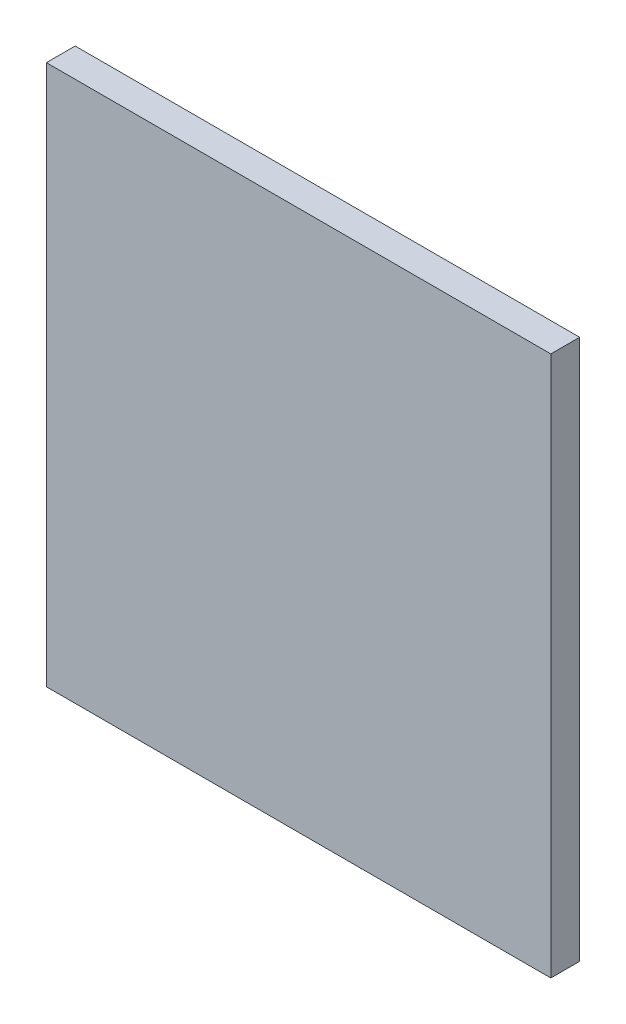
ISO-10303-21;
HEADER;
FILE_DESCRIPTION(('STEP AP214'),'2;1');
FILE_NAME('part.step','',(''),(''),'','','');
FILE_SCHEMA(('AUTOMOTIVE_DESIGN { 1 0 10303 214 1 1 1 1 }'));
ENDSEC;
DATA;
#1=APPLICATION_CONTEXT('core data for automotive mechanical design processes');
#2=APPLICATION_PROTOCOL_DEFINITION('international standard','automotive_design',2000,#1);
#3=PRODUCT_CONTEXT('',#1,'mechanical');
#4=PRODUCT('Part','Part','',(#3));
#5=PRODUCT_RELATED_PRODUCT_CATEGORY('part','',(#4));
#6=PRODUCT_DEFINITION_FORMATION('','',#4);
#7=PRODUCT_DEFINITION_CONTEXT('part definition',#1,'design');
#8=PRODUCT_DEFINITION('design','',#6,#7);
#9=PRODUCT_DEFINITION_SHAPE('','',#8);
#10=(LENGTH_UNIT() NAMED_UNIT(*) SI_UNIT(.MILLI.,.METRE.));
#11=(NAMED_UNIT(*) PLANE_ANGLE_UNIT() SI_UNIT($,.RADIAN.));
#12=(NAMED_UNIT(*) SI_UNIT($,.STERADIAN.) SOLID_ANGLE_UNIT());
#13=UNCERTAINTY_MEASURE_WITH_UNIT(LENGTH_MEASURE(1.E-05),#10,'distance_accuracy_value','');
#14=(GEOMETRIC_REPRESENTATION_CONTEXT(3) GLOBAL_UNCERTAINTY_ASSIGNED_CONTEXT((#13)) GLOBAL_UNIT_ASSIGNED_CONTEXT((#10,
#11,#12)) REPRESENTATION_CONTEXT('',''));
#15=CARTESIAN_POINT('',(0.,0.,0.));
#16=DIRECTION('',(0.,0.,1.));
#17=DIRECTION('',(1.,0.,0.));
#18=AXIS2_PLACEMENT_3D('',#15,#16,#17);
#19=CARTESIAN_POINT('',(0.,0.,4.));
#20=DIRECTION('',(1.,0.,0.));
#21=DIRECTION('',(0.,0.,-1.));
#22=AXIS2_PLACEMENT_3D('',#19,#20,#21);
#23=PLANE('',#22);
#24=DIRECTION('',(0.,-1.,0.));
#25=VECTOR('',#24,1.);
#26=CARTESIAN_POINT('',(0.,0.,0.));
#27=LINE('',#26,#25);
#28=CARTESIAN_POINT('',(0.,75.,0.));
#29=VERTEX_POINT('',#28);
#30=CARTESIAN_POINT('',(0.,0.,0.));
#31=VERTEX_POINT('',#30);
#32=EDGE_CURVE('E108',#29,#31,#27,.T.);
#33=ORIENTED_EDGE('',*,*,#32,.T.);
#34=DIRECTION('',(0.,0.,-1.));
#35=VECTOR('',#34,1.);
#36=CARTESIAN_POINT('',(0.,0.,4.));
#37=LINE('',#36,#35);
#38=CARTESIAN_POINT('',(0.,0.,4.));
#39=VERTEX_POINT('',#38);
#40=EDGE_CURVE('E11',#39,#31,#37,.T.);
#41=ORIENTED_EDGE('',*,*,#40,.F.);
#42=DIRECTION('',(0.,-1.,0.));
#43=VECTOR('',#42,1.);
#44=CARTESIAN_POINT('',(0.,0.,4.));
#45=LINE('',#44,#43);
#46=CARTESIAN_POINT('',(0.,75.,4.));
#47=VERTEX_POINT('',#46);
#48=EDGE_CURVE('E92',#47,#39,#45,.T.);
#49=ORIENTED_EDGE('',*,*,#48,.F.);
#50=DIRECTION('',(0.,0.,-1.));
#51=VECTOR('',#50,1.);
#52=CARTESIAN_POINT('',(0.,75.,4.));
#53=LINE('',#52,#51);
#54=EDGE_CURVE('E105',#47,#29,#53,.T.);
#55=ORIENTED_EDGE('',*,*,#54,.T.);
#56=EDGE_LOOP('',(#33,#41,#49,#55));
#57=FACE_BOUND('',#56,.T.);
#58=ADVANCED_FACE('F43',(#57),#23,.F.);
#59=CARTESIAN_POINT('',(0.,0.,4.));
#60=DIRECTION('',(0.,1.,0.));
#61=DIRECTION('',(0.,0.,1.));
#62=AXIS2_PLACEMENT_3D('',#59,#60,#61);
#63=PLANE('',#62);
#64=DIRECTION('',(1.,0.,0.));
#65=VECTOR('',#64,1.);
#66=CARTESIAN_POINT('',(0.,0.,0.));
#67=LINE('',#66,#65);
#68=CARTESIAN_POINT('',(70.,0.,0.));
#69=VERTEX_POINT('',#68);
#70=EDGE_CURVE('E97',#31,#69,#67,.T.);
#71=ORIENTED_EDGE('',*,*,#70,.T.);
#72=DIRECTION('',(0.,0.,-1.));
#73=VECTOR('',#72,1.);
#74=CARTESIAN_POINT('',(70.,0.,4.));
#75=LINE('',#74,#73);
#76=CARTESIAN_POINT('',(70.,0.,4.));
#77=VERTEX_POINT('',#76);
#78=EDGE_CURVE('E51',#77,#69,#75,.T.);
#79=ORIENTED_EDGE('',*,*,#78,.F.);
#80=DIRECTION('',(1.,0.,0.));
#81=VECTOR('',#80,1.);
#82=CARTESIAN_POINT('',(0.,0.,4.));
#83=LINE('',#82,#81);
#84=EDGE_CURVE('E87',#39,#77,#83,.T.);
#85=ORIENTED_EDGE('',*,*,#84,.F.);
#86=ORIENTED_EDGE('',*,*,#40,.T.);
#87=EDGE_LOOP('',(#71,#79,#85,#86));
#88=FACE_BOUND('',#87,.T.);
#89=ADVANCED_FACE('F100',(#88),#63,.F.);
#90=CARTESIAN_POINT('',(70.,0.,4.));
#91=DIRECTION('',(-1.,0.,0.));
#92=DIRECTION('',(0.,0.,1.));
#93=AXIS2_PLACEMENT_3D('',#90,#91,#92);
#94=PLANE('',#93);
#95=DIRECTION('',(0.,1.,0.));
#96=VECTOR('',#95,1.);
#97=CARTESIAN_POINT('',(70.,0.,0.));
#98=LINE('',#97,#96);
#99=CARTESIAN_POINT('',(70.,75.,0.));
#100=VERTEX_POINT('',#99);
#101=EDGE_CURVE('E78',#69,#100,#98,.T.);
#102=ORIENTED_EDGE('',*,*,#101,.T.);
#103=DIRECTION('',(0.,0.,-1.));
#104=VECTOR('',#103,1.);
#105=CARTESIAN_POINT('',(70.,75.,4.));
#106=LINE('',#105,#104);
#107=CARTESIAN_POINT('',(70.,75.,4.));
#108=VERTEX_POINT('',#107);
#109=EDGE_CURVE('E98',#108,#100,#106,.T.);
#110=ORIENTED_EDGE('',*,*,#109,.F.);
#111=DIRECTION('',(0.,1.,0.));
#112=VECTOR('',#111,1.);
#113=CARTESIAN_POINT('',(70.,0.,4.));
#114=LINE('',#113,#112);
#115=EDGE_CURVE('E95',#77,#108,#114,.T.);
#116=ORIENTED_EDGE('',*,*,#115,.F.);
#117=ORIENTED_EDGE('',*,*,#78,.T.);
#118=EDGE_LOOP('',(#102,#110,#116,#117));
#119=FACE_BOUND('',#118,.T.);
#120=ADVANCED_FACE('F99',(#119),#94,.F.);
#121=CARTESIAN_POINT('',(0.,75.,4.));
#122=DIRECTION('',(0.,-1.,0.));
#123=DIRECTION('',(0.,0.,-1.));
#124=AXIS2_PLACEMENT_3D('',#121,#122,#123);
#125=PLANE('',#124);
#126=DIRECTION('',(-1.,0.,0.));
#127=VECTOR('',#126,1.);
#128=CARTESIAN_POINT('',(0.,75.,0.));
#129=LINE('',#128,#127);
#130=EDGE_CURVE('E85',#100,#29,#129,.T.);
#131=ORIENTED_EDGE('',*,*,#130,.T.);
#132=ORIENTED_EDGE('',*,*,#54,.F.);
#133=DIRECTION('',(-1.,0.,0.));
#134=VECTOR('',#133,1.);
#135=CARTESIAN_POINT('',(0.,75.,4.));
#136=LINE('',#135,#134);
#137=EDGE_CURVE('E56',#108,#47,#136,.T.);
#138=ORIENTED_EDGE('',*,*,#137,.F.);
#139=ORIENTED_EDGE('',*,*,#109,.T.);
#140=EDGE_LOOP('',(#131,#132,#138,#139));
#141=FACE_BOUND('',#140,.T.);
#142=ADVANCED_FACE('F111',(#141),#125,.F.);
#143=CARTESIAN_POINT('',(0.,0.,4.));
#144=DIRECTION('',(0.,0.,-1.));
#145=DIRECTION('',(-1.,0.,0.));
#146=AXIS2_PLACEMENT_3D('',#143,#144,#145);
#147=PLANE('',#146);
#148=ORIENTED_EDGE('',*,*,#48,.T.);
#149=ORIENTED_EDGE('',*,*,#84,.T.);
#150=ORIENTED_EDGE('',*,*,#115,.T.);
#151=ORIENTED_EDGE('',*,*,#137,.T.);
#152=EDGE_LOOP('',(#148,#149,#150,#151));
#153=FACE_BOUND('',#152,.T.);
#154=ADVANCED_FACE('F89',(#153),#147,.F.);
#155=CARTESIAN_POINT('',(0.,0.,0.));
#156=DIRECTION('',(0.,0.,-1.));
#157=DIRECTION('',(-1.,0.,0.));
#158=AXIS2_PLACEMENT_3D('',#155,#156,#157);
#159=PLANE('',#158);
#160=ORIENTED_EDGE('',*,*,#32,.F.);
#161=ORIENTED_EDGE('',*,*,#130,.F.);
#162=ORIENTED_EDGE('',*,*,#101,.F.);
#163=ORIENTED_EDGE('',*,*,#70,.F.);
#164=EDGE_LOOP('',(#160,#161,#162,#163));
#165=FACE_BOUND('',#164,.T.);
#166=ADVANCED_FACE('F118',(#165),#159,.T.);
#167=CLOSED_SHELL('',(#58,#89,#120,#142,#154,#166));
#168=MANIFOLD_SOLID_BREP('B2',#167);
#169=ADVANCED_BREP_SHAPE_REPRESENTATION('',(#18,#168),#14);
#170=SHAPE_DEFINITION_REPRESENTATION(#9,#169);
ENDSEC;
END-ISO-10303-21;
